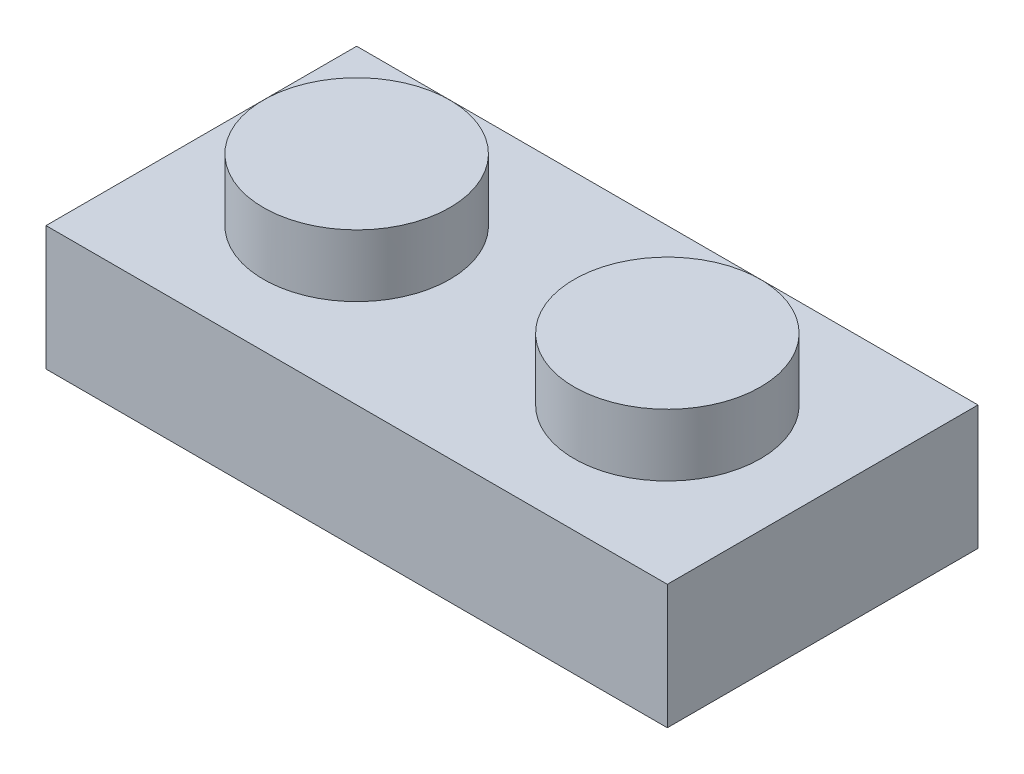
ISO-10303-21;
HEADER;
FILE_DESCRIPTION(('STEP AP214'),'2;1');
FILE_NAME('part.step','',(''),(''),'','','');
FILE_SCHEMA(('AUTOMOTIVE_DESIGN { 1 0 10303 214 1 1 1 1 }'));
ENDSEC;
DATA;
#1=APPLICATION_CONTEXT('core data for automotive mechanical design processes');
#2=APPLICATION_PROTOCOL_DEFINITION('international standard','automotive_design',2000,#1);
#3=PRODUCT_CONTEXT('',#1,'mechanical');
#4=PRODUCT('Part','Part','',(#3));
#5=PRODUCT_RELATED_PRODUCT_CATEGORY('part','',(#4));
#6=PRODUCT_DEFINITION_FORMATION('','',#4);
#7=PRODUCT_DEFINITION_CONTEXT('part definition',#1,'design');
#8=PRODUCT_DEFINITION('design','',#6,#7);
#9=PRODUCT_DEFINITION_SHAPE('','',#8);
#10=(LENGTH_UNIT() NAMED_UNIT(*) SI_UNIT(.MILLI.,.METRE.));
#11=(NAMED_UNIT(*) PLANE_ANGLE_UNIT() SI_UNIT($,.RADIAN.));
#12=(NAMED_UNIT(*) SI_UNIT($,.STERADIAN.) SOLID_ANGLE_UNIT());
#13=UNCERTAINTY_MEASURE_WITH_UNIT(LENGTH_MEASURE(1.E-05),#10,'distance_accuracy_value','');
#14=(GEOMETRIC_REPRESENTATION_CONTEXT(3) GLOBAL_UNCERTAINTY_ASSIGNED_CONTEXT((#13)) GLOBAL_UNIT_ASSIGNED_CONTEXT((#10,
#11,#12)) REPRESENTATION_CONTEXT('',''));
#15=CARTESIAN_POINT('',(0.,0.,0.));
#16=DIRECTION('',(0.,0.,1.));
#17=DIRECTION('',(1.,0.,0.));
#18=AXIS2_PLACEMENT_3D('',#15,#16,#17);
#19=CARTESIAN_POINT('',(12.,1.6,0.));
#20=DIRECTION('',(-1.,0.,0.));
#21=DIRECTION('',(0.,0.,1.));
#22=AXIS2_PLACEMENT_3D('',#19,#20,#21);
#23=PLANE('',#22);
#24=DIRECTION('',(0.,0.,-1.));
#25=VECTOR('',#24,1.);
#26=CARTESIAN_POINT('',(12.,0.,0.));
#27=LINE('',#26,#25);
#28=CARTESIAN_POINT('',(12.,0.,4.));
#29=VERTEX_POINT('',#28);
#30=CARTESIAN_POINT('',(12.,0.,-4.));
#31=VERTEX_POINT('',#30);
#32=EDGE_CURVE('E98',#29,#31,#27,.T.);
#33=ORIENTED_EDGE('',*,*,#32,.T.);
#34=DIRECTION('',(0.,-1.,0.));
#35=VECTOR('',#34,1.);
#36=CARTESIAN_POINT('',(12.,1.6,-4.));
#37=LINE('',#36,#35);
#38=CARTESIAN_POINT('',(12.,3.2,-4.));
#39=VERTEX_POINT('',#38);
#40=EDGE_CURVE('E111',#39,#31,#37,.T.);
#41=ORIENTED_EDGE('',*,*,#40,.F.);
#42=DIRECTION('',(0.,0.,-1.));
#43=VECTOR('',#42,1.);
#44=CARTESIAN_POINT('',(12.,3.2,0.));
#45=LINE('',#44,#43);
#46=CARTESIAN_POINT('',(12.,3.2,4.));
#47=VERTEX_POINT('',#46);
#48=EDGE_CURVE('E11',#47,#39,#45,.T.);
#49=ORIENTED_EDGE('',*,*,#48,.F.);
#50=DIRECTION('',(0.,1.,0.));
#51=VECTOR('',#50,1.);
#52=CARTESIAN_POINT('',(12.,1.6,4.));
#53=LINE('',#52,#51);
#54=EDGE_CURVE('E93',#29,#47,#53,.T.);
#55=ORIENTED_EDGE('',*,*,#54,.F.);
#56=EDGE_LOOP('',(#33,#41,#49,#55));
#57=FACE_BOUND('',#56,.T.);
#58=ADVANCED_FACE('F17',(#57),#23,.F.);
#59=CARTESIAN_POINT('',(4.,3.2,0.));
#60=DIRECTION('',(0.,-1.,0.));
#61=DIRECTION('',(0.,0.,-1.));
#62=AXIS2_PLACEMENT_3D('',#59,#60,#61);
#63=PLANE('',#62);
#64=ORIENTED_EDGE('',*,*,#48,.T.);
#65=DIRECTION('',(1.,0.,0.));
#66=VECTOR('',#65,1.);
#67=CARTESIAN_POINT('',(4.,3.2,-4.));
#68=LINE('',#67,#66);
#69=CARTESIAN_POINT('',(-4.,3.2,-4.));
#70=VERTEX_POINT('',#69);
#71=EDGE_CURVE('E103',#70,#39,#68,.T.);
#72=ORIENTED_EDGE('',*,*,#71,.F.);
#73=DIRECTION('',(0.,0.,-1.));
#74=VECTOR('',#73,1.);
#75=CARTESIAN_POINT('',(-4.,3.2,0.));
#76=LINE('',#75,#74);
#77=CARTESIAN_POINT('',(-4.,3.2,4.));
#78=VERTEX_POINT('',#77);
#79=EDGE_CURVE('E27',#78,#70,#76,.T.);
#80=ORIENTED_EDGE('',*,*,#79,.F.);
#81=DIRECTION('',(-1.,0.,0.));
#82=VECTOR('',#81,1.);
#83=CARTESIAN_POINT('',(4.,3.2,4.));
#84=LINE('',#83,#82);
#85=EDGE_CURVE('E118',#47,#78,#84,.T.);
#86=ORIENTED_EDGE('',*,*,#85,.F.);
#87=EDGE_LOOP('',(#64,#72,#80,#86));
#88=FACE_BOUND('',#87,.T.);
#89=CARTESIAN_POINT('',(0.,3.2,0.));
#90=DIRECTION('',(0.,-1.,0.));
#91=DIRECTION('',(1.,0.,0.));
#92=AXIS2_PLACEMENT_3D('',#89,#90,#91);
#93=CIRCLE('',#92,2.4);
#94=CARTESIAN_POINT('',(-2.4,3.2,0.));
#95=VERTEX_POINT('',#94);
#96=EDGE_CURVE('E91',#95,#95,#93,.T.);
#97=ORIENTED_EDGE('',*,*,#96,.T.);
#98=EDGE_LOOP('',(#97));
#99=FACE_BOUND('',#98,.T.);
#100=CARTESIAN_POINT('',(8.,3.2,0.));
#101=DIRECTION('',(0.,-1.,0.));
#102=DIRECTION('',(1.,0.,0.));
#103=AXIS2_PLACEMENT_3D('',#100,#101,#102);
#104=CIRCLE('',#103,2.4);
#105=CARTESIAN_POINT('',(5.6,3.2,0.));
#106=VERTEX_POINT('',#105);
#107=EDGE_CURVE('E92',#106,#106,#104,.T.);
#108=ORIENTED_EDGE('',*,*,#107,.T.);
#109=EDGE_LOOP('',(#108));
#110=FACE_BOUND('',#109,.T.);
#111=ADVANCED_FACE('F138',(#88,#99,#110),#63,.F.);
#112=CARTESIAN_POINT('',(-4.,1.6,0.));
#113=DIRECTION('',(1.,0.,0.));
#114=DIRECTION('',(0.,0.,-1.));
#115=AXIS2_PLACEMENT_3D('',#112,#113,#114);
#116=PLANE('',#115);
#117=ORIENTED_EDGE('',*,*,#79,.T.);
#118=DIRECTION('',(0.,1.,0.));
#119=VECTOR('',#118,1.);
#120=CARTESIAN_POINT('',(-4.,1.6,-4.));
#121=LINE('',#120,#119);
#122=CARTESIAN_POINT('',(-4.,0.,-4.));
#123=VERTEX_POINT('',#122);
#124=EDGE_CURVE('E107',#123,#70,#121,.T.);
#125=ORIENTED_EDGE('',*,*,#124,.F.);
#126=DIRECTION('',(0.,0.,-1.));
#127=VECTOR('',#126,1.);
#128=CARTESIAN_POINT('',(-4.,0.,0.));
#129=LINE('',#128,#127);
#130=CARTESIAN_POINT('',(-4.,0.,4.));
#131=VERTEX_POINT('',#130);
#132=EDGE_CURVE('E106',#131,#123,#129,.T.);
#133=ORIENTED_EDGE('',*,*,#132,.F.);
#134=DIRECTION('',(0.,-1.,0.));
#135=VECTOR('',#134,1.);
#136=CARTESIAN_POINT('',(-4.,1.6,4.));
#137=LINE('',#136,#135);
#138=EDGE_CURVE('E115',#78,#131,#137,.T.);
#139=ORIENTED_EDGE('',*,*,#138,.F.);
#140=EDGE_LOOP('',(#117,#125,#133,#139));
#141=FACE_BOUND('',#140,.T.);
#142=ADVANCED_FACE('F142',(#141),#116,.F.);
#143=CARTESIAN_POINT('',(4.,0.,0.));
#144=DIRECTION('',(0.,1.,0.));
#145=DIRECTION('',(0.,0.,1.));
#146=AXIS2_PLACEMENT_3D('',#143,#144,#145);
#147=PLANE('',#146);
#148=ORIENTED_EDGE('',*,*,#132,.T.);
#149=DIRECTION('',(-1.,0.,0.));
#150=VECTOR('',#149,1.);
#151=CARTESIAN_POINT('',(4.,0.,-4.));
#152=LINE('',#151,#150);
#153=EDGE_CURVE('E108',#31,#123,#152,.T.);
#154=ORIENTED_EDGE('',*,*,#153,.F.);
#155=ORIENTED_EDGE('',*,*,#32,.F.);
#156=DIRECTION('',(1.,0.,0.));
#157=VECTOR('',#156,1.);
#158=CARTESIAN_POINT('',(4.,0.,4.));
#159=LINE('',#158,#157);
#160=EDGE_CURVE('E112',#131,#29,#159,.T.);
#161=ORIENTED_EDGE('',*,*,#160,.F.);
#162=EDGE_LOOP('',(#148,#154,#155,#161));
#163=FACE_BOUND('',#162,.T.);
#164=CARTESIAN_POINT('',(0.,0.,0.));
#165=DIRECTION('',(0.,1.,0.));
#166=DIRECTION('',(1.,0.,0.));
#167=AXIS2_PLACEMENT_3D('',#164,#165,#166);
#168=CIRCLE('',#167,2.4);
#169=CARTESIAN_POINT('',(-2.4,0.,0.));
#170=VERTEX_POINT('',#169);
#171=EDGE_CURVE('E100',#170,#170,#168,.T.);
#172=ORIENTED_EDGE('',*,*,#171,.T.);
#173=EDGE_LOOP('',(#172));
#174=FACE_BOUND('',#173,.T.);
#175=CARTESIAN_POINT('',(8.,0.,0.));
#176=DIRECTION('',(0.,1.,0.));
#177=DIRECTION('',(1.,0.,0.));
#178=AXIS2_PLACEMENT_3D('',#175,#176,#177);
#179=CIRCLE('',#178,2.4);
#180=CARTESIAN_POINT('',(5.6,0.,0.));
#181=VERTEX_POINT('',#180);
#182=EDGE_CURVE('E119',#181,#181,#179,.T.);
#183=ORIENTED_EDGE('',*,*,#182,.T.);
#184=EDGE_LOOP('',(#183));
#185=FACE_BOUND('',#184,.T.);
#186=ADVANCED_FACE('F134',(#163,#174,#185),#147,.F.);
#187=CARTESIAN_POINT('',(4.,1.6,-4.));
#188=DIRECTION('',(0.,0.,1.));
#189=DIRECTION('',(1.,0.,0.));
#190=AXIS2_PLACEMENT_3D('',#187,#188,#189);
#191=PLANE('',#190);
#192=ORIENTED_EDGE('',*,*,#40,.T.);
#193=ORIENTED_EDGE('',*,*,#153,.T.);
#194=ORIENTED_EDGE('',*,*,#124,.T.);
#195=ORIENTED_EDGE('',*,*,#71,.T.);
#196=EDGE_LOOP('',(#192,#193,#194,#195));
#197=FACE_BOUND('',#196,.T.);
#198=ADVANCED_FACE('F137',(#197),#191,.F.);
#199=CARTESIAN_POINT('',(4.,1.6,4.));
#200=DIRECTION('',(0.,0.,1.));
#201=DIRECTION('',(1.,0.,0.));
#202=AXIS2_PLACEMENT_3D('',#199,#200,#201);
#203=PLANE('',#202);
#204=ORIENTED_EDGE('',*,*,#54,.T.);
#205=ORIENTED_EDGE('',*,*,#85,.T.);
#206=ORIENTED_EDGE('',*,*,#138,.T.);
#207=ORIENTED_EDGE('',*,*,#160,.T.);
#208=EDGE_LOOP('',(#204,#205,#206,#207));
#209=FACE_BOUND('',#208,.T.);
#210=ADVANCED_FACE('F141',(#209),#203,.T.);
#211=CARTESIAN_POINT('',(0.,4.8,0.));
#212=DIRECTION('',(0.,1.,0.));
#213=DIRECTION('',(1.,0.,0.));
#214=AXIS2_PLACEMENT_3D('',#211,#212,#213);
#215=PLANE('',#214);
#216=CARTESIAN_POINT('',(0.,4.8,0.));
#217=DIRECTION('',(0.,1.,0.));
#218=DIRECTION('',(1.,0.,0.));
#219=AXIS2_PLACEMENT_3D('',#216,#217,#218);
#220=CIRCLE('',#219,2.4);
#221=CARTESIAN_POINT('',(2.4,4.8,0.));
#222=VERTEX_POINT('',#221);
#223=EDGE_CURVE('E88',#222,#222,#220,.T.);
#224=ORIENTED_EDGE('',*,*,#223,.T.);
#225=EDGE_LOOP('',(#224));
#226=FACE_BOUND('',#225,.T.);
#227=ADVANCED_FACE('F89',(#226),#215,.T.);
#228=CARTESIAN_POINT('',(0.,3.75,0.));
#229=DIRECTION('',(0.,-1.,0.));
#230=DIRECTION('',(1.,0.,0.));
#231=AXIS2_PLACEMENT_3D('',#228,#229,#230);
#232=CYLINDRICAL_SURFACE('',#231,2.4);
#233=ORIENTED_EDGE('',*,*,#96,.F.);
#234=EDGE_LOOP('',(#233));
#235=FACE_BOUND('',#234,.T.);
#236=ORIENTED_EDGE('',*,*,#223,.F.);
#237=EDGE_LOOP('',(#236));
#238=FACE_BOUND('',#237,.T.);
#239=ADVANCED_FACE('F158',(#235,#238),#232,.T.);
#240=CARTESIAN_POINT('',(8.,4.8,0.));
#241=DIRECTION('',(0.,1.,0.));
#242=DIRECTION('',(1.,0.,0.));
#243=AXIS2_PLACEMENT_3D('',#240,#241,#242);
#244=PLANE('',#243);
#245=CARTESIAN_POINT('',(8.,4.8,0.));
#246=DIRECTION('',(0.,1.,0.));
#247=DIRECTION('',(1.,0.,0.));
#248=AXIS2_PLACEMENT_3D('',#245,#246,#247);
#249=CIRCLE('',#248,2.4);
#250=CARTESIAN_POINT('',(10.4,4.8,0.));
#251=VERTEX_POINT('',#250);
#252=EDGE_CURVE('E82',#251,#251,#249,.T.);
#253=ORIENTED_EDGE('',*,*,#252,.T.);
#254=EDGE_LOOP('',(#253));
#255=FACE_BOUND('',#254,.T.);
#256=ADVANCED_FACE('F19',(#255),#244,.T.);
#257=CARTESIAN_POINT('',(8.,3.75,0.));
#258=DIRECTION('',(0.,-1.,0.));
#259=DIRECTION('',(1.,0.,0.));
#260=AXIS2_PLACEMENT_3D('',#257,#258,#259);
#261=CYLINDRICAL_SURFACE('',#260,2.4);
#262=ORIENTED_EDGE('',*,*,#107,.F.);
#263=EDGE_LOOP('',(#262));
#264=FACE_BOUND('',#263,.T.);
#265=ORIENTED_EDGE('',*,*,#252,.F.);
#266=EDGE_LOOP('',(#265));
#267=FACE_BOUND('',#266,.T.);
#268=ADVANCED_FACE('F162',(#264,#267),#261,.T.);
#269=CARTESIAN_POINT('',(0.,1.6,0.));
#270=DIRECTION('',(0.,1.,0.));
#271=DIRECTION('',(1.,0.,0.));
#272=AXIS2_PLACEMENT_3D('',#269,#270,#271);
#273=PLANE('',#272);
#274=CARTESIAN_POINT('',(0.,1.6,0.));
#275=DIRECTION('',(0.,1.,0.));
#276=DIRECTION('',(1.,0.,0.));
#277=AXIS2_PLACEMENT_3D('',#274,#275,#276);
#278=CIRCLE('',#277,2.4);
#279=CARTESIAN_POINT('',(2.4,1.6,0.));
#280=VERTEX_POINT('',#279);
#281=EDGE_CURVE('E21',#280,#280,#278,.T.);
#282=ORIENTED_EDGE('',*,*,#281,.F.);
#283=EDGE_LOOP('',(#282));
#284=FACE_BOUND('',#283,.T.);
#285=ADVANCED_FACE('F165',(#284),#273,.F.);
#286=CARTESIAN_POINT('',(0.,0.55,0.));
#287=DIRECTION('',(0.,-1.,0.));
#288=DIRECTION('',(1.,0.,0.));
#289=AXIS2_PLACEMENT_3D('',#286,#287,#288);
#290=CYLINDRICAL_SURFACE('',#289,2.4);
#291=ORIENTED_EDGE('',*,*,#281,.T.);
#292=EDGE_LOOP('',(#291));
#293=FACE_BOUND('',#292,.T.);
#294=ORIENTED_EDGE('',*,*,#171,.F.);
#295=EDGE_LOOP('',(#294));
#296=FACE_BOUND('',#295,.T.);
#297=ADVANCED_FACE('F176',(#293,#296),#290,.F.);
#298=CARTESIAN_POINT('',(8.,1.6,0.));
#299=DIRECTION('',(0.,1.,0.));
#300=DIRECTION('',(1.,0.,0.));
#301=AXIS2_PLACEMENT_3D('',#298,#299,#300);
#302=PLANE('',#301);
#303=CARTESIAN_POINT('',(8.,1.6,0.));
#304=DIRECTION('',(0.,1.,0.));
#305=DIRECTION('',(1.,0.,0.));
#306=AXIS2_PLACEMENT_3D('',#303,#304,#305);
#307=CIRCLE('',#306,2.4);
#308=CARTESIAN_POINT('',(10.4,1.6,0.));
#309=VERTEX_POINT('',#308);
#310=EDGE_CURVE('E102',#309,#309,#307,.T.);
#311=ORIENTED_EDGE('',*,*,#310,.F.);
#312=EDGE_LOOP('',(#311));
#313=FACE_BOUND('',#312,.T.);
#314=ADVANCED_FACE('F170',(#313),#302,.F.);
#315=CARTESIAN_POINT('',(8.,0.55,0.));
#316=DIRECTION('',(0.,-1.,0.));
#317=DIRECTION('',(1.,0.,0.));
#318=AXIS2_PLACEMENT_3D('',#315,#316,#317);
#319=CYLINDRICAL_SURFACE('',#318,2.4);
#320=ORIENTED_EDGE('',*,*,#310,.T.);
#321=EDGE_LOOP('',(#320));
#322=FACE_BOUND('',#321,.T.);
#323=ORIENTED_EDGE('',*,*,#182,.F.);
#324=EDGE_LOOP('',(#323));
#325=FACE_BOUND('',#324,.T.);
#326=ADVANCED_FACE('F167',(#322,#325),#319,.F.);
#327=CLOSED_SHELL('',(#58,#111,#142,#186,#198,#210,#227,#239,#256,#268,#285,#297,#314,#326));
#328=MANIFOLD_SOLID_BREP('B1',#327);
#329=ADVANCED_BREP_SHAPE_REPRESENTATION('',(#18,#328),#14);
#330=SHAPE_DEFINITION_REPRESENTATION(#9,#329);
ENDSEC;
END-ISO-10303-21;
